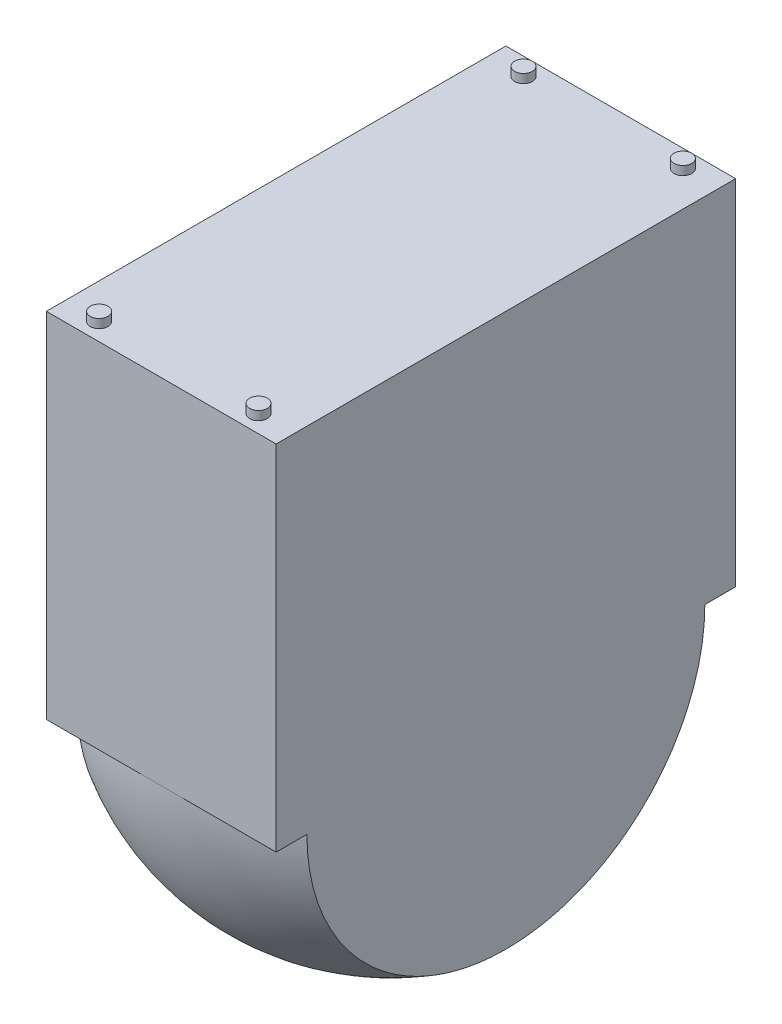
ISO-10303-21;
HEADER;
FILE_DESCRIPTION(('STEP AP214'),'2;1');
FILE_NAME('part.step','',(''),(''),'','','');
FILE_SCHEMA(('AUTOMOTIVE_DESIGN { 1 0 10303 214 1 1 1 1 }'));
ENDSEC;
DATA;
#1=APPLICATION_CONTEXT('core data for automotive mechanical design processes');
#2=APPLICATION_PROTOCOL_DEFINITION('international standard','automotive_design',2000,#1);
#3=PRODUCT_CONTEXT('',#1,'mechanical');
#4=PRODUCT('Part','Part','',(#3));
#5=PRODUCT_RELATED_PRODUCT_CATEGORY('part','',(#4));
#6=PRODUCT_DEFINITION_FORMATION('','',#4);
#7=PRODUCT_DEFINITION_CONTEXT('part definition',#1,'design');
#8=PRODUCT_DEFINITION('design','',#6,#7);
#9=PRODUCT_DEFINITION_SHAPE('','',#8);
#10=(LENGTH_UNIT() NAMED_UNIT(*) SI_UNIT(.MILLI.,.METRE.));
#11=(NAMED_UNIT(*) PLANE_ANGLE_UNIT() SI_UNIT($,.RADIAN.));
#12=(NAMED_UNIT(*) SI_UNIT($,.STERADIAN.) SOLID_ANGLE_UNIT());
#13=UNCERTAINTY_MEASURE_WITH_UNIT(LENGTH_MEASURE(1.E-05),#10,'distance_accuracy_value','');
#14=(GEOMETRIC_REPRESENTATION_CONTEXT(3) GLOBAL_UNCERTAINTY_ASSIGNED_CONTEXT((#13)) GLOBAL_UNIT_ASSIGNED_CONTEXT((#10,
#11,#12)) REPRESENTATION_CONTEXT('',''));
#15=CARTESIAN_POINT('',(0.,0.,0.));
#16=DIRECTION('',(0.,0.,1.));
#17=DIRECTION('',(1.,0.,0.));
#18=AXIS2_PLACEMENT_3D('',#15,#16,#17);
#19=CARTESIAN_POINT('',(0.,0.,0.));
#20=DIRECTION('',(0.,1.,0.));
#21=DIRECTION('',(1.,0.,0.));
#22=AXIS2_PLACEMENT_3D('',#19,#20,#21);
#23=SPHERICAL_SURFACE('',#22,130.);
#24=CARTESIAN_POINT('',(65.,0.,0.));
#25=DIRECTION('',(1.,0.,0.));
#26=DIRECTION('',(0.,0.,-1.));
#27=AXIS2_PLACEMENT_3D('',#24,#25,#26);
#28=CIRCLE('',#27,112.583302491977);
#29=CARTESIAN_POINT('',(65.,0.,112.583302491977));
#30=VERTEX_POINT('',#29);
#31=CARTESIAN_POINT('',(65.,0.,-112.583302491977));
#32=VERTEX_POINT('',#31);
#33=EDGE_CURVE('E219',#30,#32,#28,.T.);
#34=ORIENTED_EDGE('',*,*,#33,.F.);
#35=CARTESIAN_POINT('',(0.,0.,0.));
#36=DIRECTION('',(0.,1.,0.));
#37=DIRECTION('',(0.,0.,1.));
#38=AXIS2_PLACEMENT_3D('',#35,#36,#37);
#39=CIRCLE('',#38,130.);
#40=CARTESIAN_POINT('',(0.,0.,130.));
#41=VERTEX_POINT('',#40);
#42=EDGE_CURVE('E240',#41,#30,#39,.T.);
#43=ORIENTED_EDGE('',*,*,#42,.F.);
#44=CARTESIAN_POINT('',(-65.,0.,112.583302491977));
#45=VERTEX_POINT('',#44);
#46=EDGE_CURVE('E231',#45,#41,#39,.T.);
#47=ORIENTED_EDGE('',*,*,#46,.F.);
#48=CARTESIAN_POINT('',(-65.,0.,0.));
#49=DIRECTION('',(-1.,0.,0.));
#50=DIRECTION('',(0.,0.,1.));
#51=AXIS2_PLACEMENT_3D('',#48,#49,#50);
#52=CIRCLE('',#51,112.583302491977);
#53=CARTESIAN_POINT('',(-65.,0.,-112.583302491977));
#54=VERTEX_POINT('',#53);
#55=EDGE_CURVE('E211',#54,#45,#52,.T.);
#56=ORIENTED_EDGE('',*,*,#55,.F.);
#57=CARTESIAN_POINT('',(0.,0.,-130.));
#58=VERTEX_POINT('',#57);
#59=EDGE_CURVE('E241',#58,#54,#39,.T.);
#60=ORIENTED_EDGE('',*,*,#59,.F.);
#61=EDGE_CURVE('E238',#32,#58,#39,.T.);
#62=ORIENTED_EDGE('',*,*,#61,.F.);
#63=EDGE_LOOP('',(#34,#43,#47,#56,#60,#62));
#64=FACE_BOUND('',#63,.T.);
#65=ADVANCED_FACE('F35',(#64),#23,.T.);
#66=CARTESIAN_POINT('',(120.,0.,120.));
#67=DIRECTION('',(0.,1.,0.));
#68=DIRECTION('',(0.,0.,1.));
#69=AXIS2_PLACEMENT_3D('',#66,#67,#68);
#70=PLANE('',#69);
#71=DIRECTION('',(0.,0.,-1.));
#72=VECTOR('',#71,1.);
#73=CARTESIAN_POINT('',(65.,0.,120.));
#74=LINE('',#73,#72);
#75=CARTESIAN_POINT('',(65.,0.,130.));
#76=VERTEX_POINT('',#75);
#77=EDGE_CURVE('E221',#76,#30,#74,.T.);
#78=ORIENTED_EDGE('',*,*,#77,.F.);
#79=DIRECTION('',(1.,0.,0.));
#80=VECTOR('',#79,1.);
#81=CARTESIAN_POINT('',(-120.,0.,130.));
#82=LINE('',#81,#80);
#83=EDGE_CURVE('E235',#41,#76,#82,.T.);
#84=ORIENTED_EDGE('',*,*,#83,.F.);
#85=ORIENTED_EDGE('',*,*,#42,.T.);
#86=EDGE_LOOP('',(#78,#84,#85));
#87=FACE_BOUND('',#86,.T.);
#88=ADVANCED_FACE('F393',(#87),#70,.F.);
#89=DIRECTION('',(0.,0.,-1.));
#90=VECTOR('',#89,1.);
#91=CARTESIAN_POINT('',(65.,0.,120.));
#92=LINE('',#91,#90);
#93=CARTESIAN_POINT('',(65.,0.,-130.));
#94=VERTEX_POINT('',#93);
#95=EDGE_CURVE('E217',#32,#94,#92,.T.);
#96=ORIENTED_EDGE('',*,*,#95,.F.);
#97=ORIENTED_EDGE('',*,*,#61,.T.);
#98=DIRECTION('',(-1.,0.,0.));
#99=VECTOR('',#98,1.);
#100=CARTESIAN_POINT('',(-120.,0.,-130.));
#101=LINE('',#100,#99);
#102=EDGE_CURVE('E232',#94,#58,#101,.T.);
#103=ORIENTED_EDGE('',*,*,#102,.F.);
#104=EDGE_LOOP('',(#96,#97,#103));
#105=FACE_BOUND('',#104,.T.);
#106=ADVANCED_FACE('F398',(#105),#70,.F.);
#107=DIRECTION('',(0.,0.,1.));
#108=VECTOR('',#107,1.);
#109=CARTESIAN_POINT('',(-65.,0.,120.));
#110=LINE('',#109,#108);
#111=CARTESIAN_POINT('',(-65.,0.,-130.));
#112=VERTEX_POINT('',#111);
#113=EDGE_CURVE('E214',#112,#54,#110,.T.);
#114=ORIENTED_EDGE('',*,*,#113,.F.);
#115=EDGE_CURVE('E223',#58,#112,#101,.T.);
#116=ORIENTED_EDGE('',*,*,#115,.F.);
#117=ORIENTED_EDGE('',*,*,#59,.T.);
#118=EDGE_LOOP('',(#114,#116,#117));
#119=FACE_BOUND('',#118,.T.);
#120=ADVANCED_FACE('F423',(#119),#70,.F.);
#121=CARTESIAN_POINT('',(-120.,200.,-130.));
#122=DIRECTION('',(0.,0.,1.));
#123=DIRECTION('',(1.,0.,0.));
#124=AXIS2_PLACEMENT_3D('',#121,#122,#123);
#125=PLANE('',#124);
#126=CARTESIAN_POINT('',(7.11121604714485,147.850864108465,-130.));
#127=DIRECTION('',(0.,0.,-1.));
#128=DIRECTION('',(-1.,0.,0.));
#129=AXIS2_PLACEMENT_3D('',#126,#127,#128);
#130=CIRCLE('',#129,1.5);
#131=CARTESIAN_POINT('',(5.61121604714485,147.850864108465,-130.));
#132=VERTEX_POINT('',#131);
#133=EDGE_CURVE('E263',#132,#132,#130,.T.);
#134=ORIENTED_EDGE('',*,*,#133,.F.);
#135=EDGE_LOOP('',(#134));
#136=FACE_BOUND('',#135,.T.);
#137=CARTESIAN_POINT('',(26.0708093918858,127.11308997908,-130.));
#138=DIRECTION('',(0.,0.,-1.));
#139=DIRECTION('',(-1.,0.,0.));
#140=AXIS2_PLACEMENT_3D('',#137,#138,#139);
#141=CIRCLE('',#140,1.5);
#142=CARTESIAN_POINT('',(24.5708093918858,127.11308997908,-130.));
#143=VERTEX_POINT('',#142);
#144=EDGE_CURVE('E461',#143,#143,#141,.T.);
#145=ORIENTED_EDGE('',*,*,#144,.F.);
#146=EDGE_LOOP('',(#145));
#147=FACE_BOUND('',#146,.T.);
#148=CARTESIAN_POINT('',(7.11121604714485,127.11308997908,-130.));
#149=DIRECTION('',(0.,0.,-1.));
#150=DIRECTION('',(-1.,0.,0.));
#151=AXIS2_PLACEMENT_3D('',#148,#149,#150);
#152=CIRCLE('',#151,1.5);
#153=CARTESIAN_POINT('',(5.61121604714484,127.11308997908,-130.));
#154=VERTEX_POINT('',#153);
#155=EDGE_CURVE('E276',#154,#154,#152,.T.);
#156=ORIENTED_EDGE('',*,*,#155,.F.);
#157=EDGE_LOOP('',(#156));
#158=FACE_BOUND('',#157,.T.);
#159=CARTESIAN_POINT('',(26.0708093918858,147.850864108465,-130.));
#160=DIRECTION('',(0.,0.,-1.));
#161=DIRECTION('',(-1.,0.,0.));
#162=AXIS2_PLACEMENT_3D('',#159,#160,#161);
#163=CIRCLE('',#162,1.5);
#164=CARTESIAN_POINT('',(24.5708093918858,147.850864108465,-130.));
#165=VERTEX_POINT('',#164);
#166=EDGE_CURVE('E259',#165,#165,#163,.T.);
#167=ORIENTED_EDGE('',*,*,#166,.F.);
#168=EDGE_LOOP('',(#167));
#169=FACE_BOUND('',#168,.T.);
#170=ORIENTED_EDGE('',*,*,#115,.T.);
#171=DIRECTION('',(0.,-1.,0.));
#172=VECTOR('',#171,1.);
#173=CARTESIAN_POINT('',(-65.,-200.,-130.));
#174=LINE('',#173,#172);
#175=CARTESIAN_POINT('',(-65.,200.,-130.));
#176=VERTEX_POINT('',#175);
#177=EDGE_CURVE('E204',#176,#112,#174,.T.);
#178=ORIENTED_EDGE('',*,*,#177,.F.);
#179=DIRECTION('',(-1.,0.,0.));
#180=VECTOR('',#179,1.);
#181=CARTESIAN_POINT('',(-120.,200.,-130.));
#182=LINE('',#181,#180);
#183=CARTESIAN_POINT('',(65.,200.,-130.));
#184=VERTEX_POINT('',#183);
#185=EDGE_CURVE('E224',#184,#176,#182,.T.);
#186=ORIENTED_EDGE('',*,*,#185,.F.);
#187=DIRECTION('',(0.,1.,0.));
#188=VECTOR('',#187,1.);
#189=CARTESIAN_POINT('',(65.,-200.,-130.));
#190=LINE('',#189,#188);
#191=EDGE_CURVE('E202',#94,#184,#190,.T.);
#192=ORIENTED_EDGE('',*,*,#191,.F.);
#193=ORIENTED_EDGE('',*,*,#102,.T.);
#194=EDGE_LOOP('',(#170,#178,#186,#192,#193));
#195=FACE_BOUND('',#194,.T.);
#196=ADVANCED_FACE('F426',(#136,#147,#158,#169,#195),#125,.F.);
#197=CARTESIAN_POINT('',(-120.,200.,130.));
#198=DIRECTION('',(0.,0.,-1.));
#199=DIRECTION('',(-1.,0.,0.));
#200=AXIS2_PLACEMENT_3D('',#197,#198,#199);
#201=PLANE('',#200);
#202=DIRECTION('',(0.,-1.,0.));
#203=VECTOR('',#202,1.);
#204=CARTESIAN_POINT('',(-65.,-200.,130.));
#205=LINE('',#204,#203);
#206=CARTESIAN_POINT('',(-65.,200.,130.));
#207=VERTEX_POINT('',#206);
#208=CARTESIAN_POINT('',(-65.,0.,130.));
#209=VERTEX_POINT('',#208);
#210=EDGE_CURVE('E200',#207,#209,#205,.T.);
#211=ORIENTED_EDGE('',*,*,#210,.T.);
#212=EDGE_CURVE('E228',#209,#41,#82,.T.);
#213=ORIENTED_EDGE('',*,*,#212,.T.);
#214=ORIENTED_EDGE('',*,*,#83,.T.);
#215=DIRECTION('',(0.,1.,0.));
#216=VECTOR('',#215,1.);
#217=CARTESIAN_POINT('',(65.,-200.,130.));
#218=LINE('',#217,#216);
#219=CARTESIAN_POINT('',(65.,200.,130.));
#220=VERTEX_POINT('',#219);
#221=EDGE_CURVE('E188',#76,#220,#218,.T.);
#222=ORIENTED_EDGE('',*,*,#221,.T.);
#223=DIRECTION('',(1.,0.,0.));
#224=VECTOR('',#223,1.);
#225=CARTESIAN_POINT('',(-120.,200.,130.));
#226=LINE('',#225,#224);
#227=EDGE_CURVE('E227',#207,#220,#226,.T.);
#228=ORIENTED_EDGE('',*,*,#227,.F.);
#229=EDGE_LOOP('',(#211,#213,#214,#222,#228));
#230=FACE_BOUND('',#229,.T.);
#231=ADVANCED_FACE('F418',(#230),#201,.F.);
#232=CARTESIAN_POINT('',(120.,200.,120.));
#233=DIRECTION('',(0.,1.,0.));
#234=DIRECTION('',(0.,0.,1.));
#235=AXIS2_PLACEMENT_3D('',#232,#233,#234);
#236=PLANE('',#235);
#237=CARTESIAN_POINT('',(45.0939865651329,200.,-120.06732195188));
#238=DIRECTION('',(0.,1.,0.));
#239=DIRECTION('',(0.,0.,-1.));
#240=AXIS2_PLACEMENT_3D('',#237,#238,#239);
#241=CIRCLE('',#240,5.00000000000001);
#242=CARTESIAN_POINT('',(45.0939865651329,200.,-125.06732195188));
#243=VERTEX_POINT('',#242);
#244=EDGE_CURVE('E295',#243,#243,#241,.T.);
#245=ORIENTED_EDGE('',*,*,#244,.F.);
#246=EDGE_LOOP('',(#245));
#247=FACE_BOUND('',#246,.T.);
#248=CARTESIAN_POINT('',(45.0939865651329,200.,120.06732195188));
#249=DIRECTION('',(0.,1.,0.));
#250=DIRECTION('',(0.,0.,1.));
#251=AXIS2_PLACEMENT_3D('',#248,#249,#250);
#252=CIRCLE('',#251,5.00000000000001);
#253=CARTESIAN_POINT('',(45.0939865651329,200.,125.06732195188));
#254=VERTEX_POINT('',#253);
#255=EDGE_CURVE('E299',#254,#254,#252,.T.);
#256=ORIENTED_EDGE('',*,*,#255,.F.);
#257=EDGE_LOOP('',(#256));
#258=FACE_BOUND('',#257,.T.);
#259=CARTESIAN_POINT('',(-45.0939865651329,200.,120.06732195188));
#260=DIRECTION('',(0.,1.,0.));
#261=DIRECTION('',(0.,0.,-1.));
#262=AXIS2_PLACEMENT_3D('',#259,#260,#261);
#263=CIRCLE('',#262,5.00000000000001);
#264=CARTESIAN_POINT('',(-45.0939865651329,200.,115.06732195188));
#265=VERTEX_POINT('',#264);
#266=EDGE_CURVE('E305',#265,#265,#263,.T.);
#267=ORIENTED_EDGE('',*,*,#266,.F.);
#268=EDGE_LOOP('',(#267));
#269=FACE_BOUND('',#268,.T.);
#270=CARTESIAN_POINT('',(-45.0939865651329,200.,-120.06732195188));
#271=DIRECTION('',(0.,1.,0.));
#272=DIRECTION('',(0.,0.,1.));
#273=AXIS2_PLACEMENT_3D('',#270,#271,#272);
#274=CIRCLE('',#273,5.00000000000001);
#275=CARTESIAN_POINT('',(-45.0939865651329,200.,-115.06732195188));
#276=VERTEX_POINT('',#275);
#277=EDGE_CURVE('E311',#276,#276,#274,.T.);
#278=ORIENTED_EDGE('',*,*,#277,.F.);
#279=EDGE_LOOP('',(#278));
#280=FACE_BOUND('',#279,.T.);
#281=ORIENTED_EDGE('',*,*,#227,.T.);
#282=DIRECTION('',(0.,0.,1.));
#283=VECTOR('',#282,1.);
#284=CARTESIAN_POINT('',(65.,200.,-130.));
#285=LINE('',#284,#283);
#286=EDGE_CURVE('E207',#184,#220,#285,.T.);
#287=ORIENTED_EDGE('',*,*,#286,.F.);
#288=ORIENTED_EDGE('',*,*,#185,.T.);
#289=DIRECTION('',(0.,0.,1.));
#290=VECTOR('',#289,1.);
#291=CARTESIAN_POINT('',(-65.,200.,-130.));
#292=LINE('',#291,#290);
#293=EDGE_CURVE('E208',#176,#207,#292,.T.);
#294=ORIENTED_EDGE('',*,*,#293,.T.);
#295=EDGE_LOOP('',(#281,#287,#288,#294));
#296=FACE_BOUND('',#295,.T.);
#297=ADVANCED_FACE('F431',(#247,#258,#269,#280,#296),#236,.T.);
#298=ORIENTED_EDGE('',*,*,#46,.T.);
#299=ORIENTED_EDGE('',*,*,#212,.F.);
#300=DIRECTION('',(0.,0.,1.));
#301=VECTOR('',#300,1.);
#302=CARTESIAN_POINT('',(-65.,0.,120.));
#303=LINE('',#302,#301);
#304=EDGE_CURVE('E242',#45,#209,#303,.T.);
#305=ORIENTED_EDGE('',*,*,#304,.F.);
#306=EDGE_LOOP('',(#298,#299,#305));
#307=FACE_BOUND('',#306,.T.);
#308=ADVANCED_FACE('F401',(#307),#70,.F.);
#309=CARTESIAN_POINT('',(-65.,-200.,-130.));
#310=DIRECTION('',(-1.,0.,0.));
#311=DIRECTION('',(0.,0.,1.));
#312=AXIS2_PLACEMENT_3D('',#309,#310,#311);
#313=PLANE('',#312);
#314=DIRECTION('',(0.,0.,1.));
#315=VECTOR('',#314,1.);
#316=CARTESIAN_POINT('',(-65.,5.,120.));
#317=LINE('',#316,#315);
#318=CARTESIAN_POINT('',(-65.,5.,-112.138307460029));
#319=VERTEX_POINT('',#318);
#320=CARTESIAN_POINT('',(-65.,5.,-106.653645038508));
#321=VERTEX_POINT('',#320);
#322=EDGE_CURVE('E159',#319,#321,#317,.T.);
#323=ORIENTED_EDGE('',*,*,#322,.F.);
#324=CARTESIAN_POINT('',(-65.,0.,0.));
#325=DIRECTION('',(1.,0.,0.));
#326=DIRECTION('',(0.,0.,1.));
#327=AXIS2_PLACEMENT_3D('',#324,#325,#326);
#328=CIRCLE('',#327,112.249721603218);
#329=CARTESIAN_POINT('',(-65.,5.,112.138307460029));
#330=VERTEX_POINT('',#329);
#331=EDGE_CURVE('E317',#319,#330,#328,.T.);
#332=ORIENTED_EDGE('',*,*,#331,.T.);
#333=DIRECTION('',(0.,0.,1.));
#334=VECTOR('',#333,1.);
#335=CARTESIAN_POINT('',(-65.,5.,120.));
#336=LINE('',#335,#334);
#337=CARTESIAN_POINT('',(-65.,5.,106.653645038508));
#338=VERTEX_POINT('',#337);
#339=EDGE_CURVE('E186',#338,#330,#336,.T.);
#340=ORIENTED_EDGE('',*,*,#339,.F.);
#341=CARTESIAN_POINT('',(-65.,0.,0.));
#342=DIRECTION('',(-1.,0.,0.));
#343=DIRECTION('',(0.,0.,1.));
#344=AXIS2_PLACEMENT_3D('',#341,#342,#343);
#345=CIRCLE('',#344,106.770782520313);
#346=EDGE_CURVE('E178',#321,#338,#345,.T.);
#347=ORIENTED_EDGE('',*,*,#346,.F.);
#348=EDGE_LOOP('',(#323,#332,#340,#347));
#349=FACE_BOUND('',#348,.T.);
#350=DIRECTION('',(0.,-1.,0.));
#351=VECTOR('',#350,1.);
#352=CARTESIAN_POINT('',(-65.,-200.,125.));
#353=LINE('',#352,#351);
#354=CARTESIAN_POINT('',(-65.,195.,125.));
#355=VERTEX_POINT('',#354);
#356=CARTESIAN_POINT('',(-65.,135.,125.));
#357=VERTEX_POINT('',#356);
#358=EDGE_CURVE('E189',#355,#357,#353,.T.);
#359=ORIENTED_EDGE('',*,*,#358,.T.);
#360=DIRECTION('',(0.,0.,-1.));
#361=VECTOR('',#360,1.);
#362=CARTESIAN_POINT('',(-65.,135.,-130.));
#363=LINE('',#362,#361);
#364=CARTESIAN_POINT('',(-65.,135.,-125.));
#365=VERTEX_POINT('',#364);
#366=EDGE_CURVE('E324',#357,#365,#363,.T.);
#367=ORIENTED_EDGE('',*,*,#366,.T.);
#368=DIRECTION('',(0.,-1.,0.));
#369=VECTOR('',#368,1.);
#370=CARTESIAN_POINT('',(-65.,200.,-125.));
#371=LINE('',#370,#369);
#372=CARTESIAN_POINT('',(-65.,195.,-125.));
#373=VERTEX_POINT('',#372);
#374=EDGE_CURVE('E196',#373,#365,#371,.T.);
#375=ORIENTED_EDGE('',*,*,#374,.F.);
#376=DIRECTION('',(0.,0.,1.));
#377=VECTOR('',#376,1.);
#378=CARTESIAN_POINT('',(-65.,195.,120.));
#379=LINE('',#378,#377);
#380=EDGE_CURVE('E185',#373,#355,#379,.T.);
#381=ORIENTED_EDGE('',*,*,#380,.T.);
#382=EDGE_LOOP('',(#359,#367,#375,#381));
#383=FACE_BOUND('',#382,.T.);
#384=ORIENTED_EDGE('',*,*,#304,.T.);
#385=ORIENTED_EDGE('',*,*,#210,.F.);
#386=ORIENTED_EDGE('',*,*,#293,.F.);
#387=ORIENTED_EDGE('',*,*,#177,.T.);
#388=ORIENTED_EDGE('',*,*,#113,.T.);
#389=ORIENTED_EDGE('',*,*,#55,.T.);
#390=EDGE_LOOP('',(#384,#385,#386,#387,#388,#389));
#391=FACE_BOUND('',#390,.T.);
#392=ADVANCED_FACE('F360',(#349,#383,#391),#313,.T.);
#393=CARTESIAN_POINT('',(65.,-200.,-130.));
#394=DIRECTION('',(1.,0.,0.));
#395=DIRECTION('',(0.,0.,-1.));
#396=AXIS2_PLACEMENT_3D('',#393,#394,#395);
#397=PLANE('',#396);
#398=ORIENTED_EDGE('',*,*,#77,.T.);
#399=ORIENTED_EDGE('',*,*,#33,.T.);
#400=ORIENTED_EDGE('',*,*,#95,.T.);
#401=ORIENTED_EDGE('',*,*,#191,.T.);
#402=ORIENTED_EDGE('',*,*,#286,.T.);
#403=ORIENTED_EDGE('',*,*,#221,.F.);
#404=EDGE_LOOP('',(#398,#399,#400,#401,#402,#403));
#405=FACE_BOUND('',#404,.T.);
#406=ADVANCED_FACE('F434',(#405),#397,.T.);
#407=CARTESIAN_POINT('',(0.,0.,0.));
#408=DIRECTION('',(0.,1.,0.));
#409=DIRECTION('',(1.,0.,0.));
#410=AXIS2_PLACEMENT_3D('',#407,#408,#409);
#411=SPHERICAL_SURFACE('',#410,125.);
#412=CARTESIAN_POINT('',(60.,0.,0.));
#413=DIRECTION('',(1.,0.,0.));
#414=DIRECTION('',(0.,0.,-1.));
#415=AXIS2_PLACEMENT_3D('',#412,#413,#414);
#416=CIRCLE('',#415,109.658560997307);
#417=CARTESIAN_POINT('',(60.,5.,109.544511501033));
#418=VERTEX_POINT('',#417);
#419=CARTESIAN_POINT('',(60.,5.,-109.544511501033));
#420=VERTEX_POINT('',#419);
#421=EDGE_CURVE('E168',#418,#420,#416,.T.);
#422=ORIENTED_EDGE('',*,*,#421,.T.);
#423=CARTESIAN_POINT('',(0.,5.,0.));
#424=DIRECTION('',(0.,1.,0.));
#425=DIRECTION('',(0.,0.,1.));
#426=AXIS2_PLACEMENT_3D('',#423,#424,#425);
#427=CIRCLE('',#426,124.899959967968);
#428=EDGE_CURVE('E153',#420,#321,#427,.T.);
#429=ORIENTED_EDGE('',*,*,#428,.T.);
#430=ORIENTED_EDGE('',*,*,#346,.T.);
#431=CARTESIAN_POINT('',(0.,5.,0.));
#432=DIRECTION('',(0.,1.,0.));
#433=DIRECTION('',(0.,0.,1.));
#434=AXIS2_PLACEMENT_3D('',#431,#432,#433);
#435=CIRCLE('',#434,124.899959967968);
#436=EDGE_CURVE('E163',#338,#418,#435,.T.);
#437=ORIENTED_EDGE('',*,*,#436,.T.);
#438=EDGE_LOOP('',(#422,#429,#430,#437));
#439=FACE_BOUND('',#438,.T.);
#440=ADVANCED_FACE('F169',(#439),#411,.F.);
#441=CARTESIAN_POINT('',(120.,5.,120.));
#442=DIRECTION('',(0.,1.,0.));
#443=DIRECTION('',(0.,0.,1.));
#444=AXIS2_PLACEMENT_3D('',#441,#442,#443);
#445=PLANE('',#444);
#446=DIRECTION('',(-1.,0.,0.));
#447=VECTOR('',#446,1.);
#448=CARTESIAN_POINT('',(-62.,5.,-112.138307460029));
#449=LINE('',#448,#447);
#450=CARTESIAN_POINT('',(-62.,5.,-112.138307460029));
#451=VERTEX_POINT('',#450);
#452=EDGE_CURVE('E55',#319,#451,#449,.F.);
#453=ORIENTED_EDGE('',*,*,#452,.F.);
#454=ORIENTED_EDGE('',*,*,#322,.T.);
#455=ORIENTED_EDGE('',*,*,#428,.F.);
#456=DIRECTION('',(0.,0.,-1.));
#457=VECTOR('',#456,1.);
#458=CARTESIAN_POINT('',(60.,5.,120.));
#459=LINE('',#458,#457);
#460=CARTESIAN_POINT('',(60.,5.,-125.));
#461=VERTEX_POINT('',#460);
#462=EDGE_CURVE('E157',#420,#461,#459,.T.);
#463=ORIENTED_EDGE('',*,*,#462,.T.);
#464=DIRECTION('',(-1.,0.,0.));
#465=VECTOR('',#464,1.);
#466=CARTESIAN_POINT('',(-120.,5.,-125.));
#467=LINE('',#466,#465);
#468=CARTESIAN_POINT('',(-62.,5.,-125.));
#469=VERTEX_POINT('',#468);
#470=EDGE_CURVE('E182',#461,#469,#467,.T.);
#471=ORIENTED_EDGE('',*,*,#470,.T.);
#472=DIRECTION('',(0.,0.,1.));
#473=VECTOR('',#472,1.);
#474=CARTESIAN_POINT('',(-62.,5.,120.));
#475=LINE('',#474,#473);
#476=EDGE_CURVE('E51',#469,#451,#475,.T.);
#477=ORIENTED_EDGE('',*,*,#476,.T.);
#478=EDGE_LOOP('',(#453,#454,#455,#463,#471,#477));
#479=FACE_BOUND('',#478,.T.);
#480=ADVANCED_FACE('F155',(#479),#445,.T.);
#481=CARTESIAN_POINT('',(-120.,200.,-125.));
#482=DIRECTION('',(0.,0.,1.));
#483=DIRECTION('',(1.,0.,0.));
#484=AXIS2_PLACEMENT_3D('',#481,#482,#483);
#485=PLANE('',#484);
#486=CARTESIAN_POINT('',(7.11121604714485,147.850864108465,-125.));
#487=DIRECTION('',(0.,0.,1.));
#488=DIRECTION('',(1.,0.,0.));
#489=AXIS2_PLACEMENT_3D('',#486,#487,#488);
#490=CIRCLE('',#489,1.5);
#491=CARTESIAN_POINT('',(8.61121604714485,147.850864108465,-125.));
#492=VERTEX_POINT('',#491);
#493=EDGE_CURVE('E38',#492,#492,#490,.T.);
#494=ORIENTED_EDGE('',*,*,#493,.F.);
#495=EDGE_LOOP('',(#494));
#496=FACE_BOUND('',#495,.T.);
#497=CARTESIAN_POINT('',(26.0708093918858,127.11308997908,-125.));
#498=DIRECTION('',(0.,0.,1.));
#499=DIRECTION('',(1.,0.,0.));
#500=AXIS2_PLACEMENT_3D('',#497,#498,#499);
#501=CIRCLE('',#500,1.5);
#502=CARTESIAN_POINT('',(27.5708093918858,127.11308997908,-125.));
#503=VERTEX_POINT('',#502);
#504=EDGE_CURVE('E262',#503,#503,#501,.T.);
#505=ORIENTED_EDGE('',*,*,#504,.F.);
#506=EDGE_LOOP('',(#505));
#507=FACE_BOUND('',#506,.T.);
#508=CARTESIAN_POINT('',(7.11121604714485,127.11308997908,-125.));
#509=DIRECTION('',(0.,0.,1.));
#510=DIRECTION('',(1.,0.,0.));
#511=AXIS2_PLACEMENT_3D('',#508,#509,#510);
#512=CIRCLE('',#511,1.5);
#513=CARTESIAN_POINT('',(8.61121604714485,127.11308997908,-125.));
#514=VERTEX_POINT('',#513);
#515=EDGE_CURVE('E260',#514,#514,#512,.T.);
#516=ORIENTED_EDGE('',*,*,#515,.F.);
#517=EDGE_LOOP('',(#516));
#518=FACE_BOUND('',#517,.T.);
#519=CARTESIAN_POINT('',(26.0708093918858,147.850864108465,-125.));
#520=DIRECTION('',(0.,0.,1.));
#521=DIRECTION('',(1.,0.,0.));
#522=AXIS2_PLACEMENT_3D('',#519,#520,#521);
#523=CIRCLE('',#522,1.5);
#524=CARTESIAN_POINT('',(27.5708093918858,147.850864108465,-125.));
#525=VERTEX_POINT('',#524);
#526=EDGE_CURVE('E255',#525,#525,#523,.T.);
#527=ORIENTED_EDGE('',*,*,#526,.F.);
#528=EDGE_LOOP('',(#527));
#529=FACE_BOUND('',#528,.T.);
#530=DIRECTION('',(-1.,0.,0.));
#531=VECTOR('',#530,1.);
#532=CARTESIAN_POINT('',(-120.,135.,-125.));
#533=LINE('',#532,#531);
#534=CARTESIAN_POINT('',(-62.,135.,-125.));
#535=VERTEX_POINT('',#534);
#536=EDGE_CURVE('E337',#535,#365,#533,.T.);
#537=ORIENTED_EDGE('',*,*,#536,.F.);
#538=DIRECTION('',(0.,-1.,0.));
#539=VECTOR('',#538,1.);
#540=CARTESIAN_POINT('',(-62.,200.,-125.));
#541=LINE('',#540,#539);
#542=EDGE_CURVE('E333',#535,#469,#541,.T.);
#543=ORIENTED_EDGE('',*,*,#542,.T.);
#544=ORIENTED_EDGE('',*,*,#470,.F.);
#545=DIRECTION('',(0.,1.,0.));
#546=VECTOR('',#545,1.);
#547=CARTESIAN_POINT('',(60.,200.,-125.));
#548=LINE('',#547,#546);
#549=CARTESIAN_POINT('',(60.,195.,-125.));
#550=VERTEX_POINT('',#549);
#551=EDGE_CURVE('E176',#461,#550,#548,.T.);
#552=ORIENTED_EDGE('',*,*,#551,.T.);
#553=DIRECTION('',(-1.,0.,0.));
#554=VECTOR('',#553,1.);
#555=CARTESIAN_POINT('',(-120.,195.,-125.));
#556=LINE('',#555,#554);
#557=EDGE_CURVE('E344',#550,#373,#556,.T.);
#558=ORIENTED_EDGE('',*,*,#557,.T.);
#559=ORIENTED_EDGE('',*,*,#374,.T.);
#560=EDGE_LOOP('',(#537,#543,#544,#552,#558,#559));
#561=FACE_BOUND('',#560,.T.);
#562=ADVANCED_FACE('F351',(#496,#507,#518,#529,#561),#485,.T.);
#563=CARTESIAN_POINT('',(-120.,200.,125.));
#564=DIRECTION('',(0.,0.,-1.));
#565=DIRECTION('',(-1.,0.,0.));
#566=AXIS2_PLACEMENT_3D('',#563,#564,#565);
#567=PLANE('',#566);
#568=DIRECTION('',(1.,0.,0.));
#569=VECTOR('',#568,1.);
#570=CARTESIAN_POINT('',(-120.,135.,125.));
#571=LINE('',#570,#569);
#572=CARTESIAN_POINT('',(-62.,135.,125.));
#573=VERTEX_POINT('',#572);
#574=EDGE_CURVE('E250',#357,#573,#571,.T.);
#575=ORIENTED_EDGE('',*,*,#574,.F.);
#576=ORIENTED_EDGE('',*,*,#358,.F.);
#577=DIRECTION('',(1.,0.,0.));
#578=VECTOR('',#577,1.);
#579=CARTESIAN_POINT('',(-120.,195.,125.));
#580=LINE('',#579,#578);
#581=CARTESIAN_POINT('',(60.,195.,125.));
#582=VERTEX_POINT('',#581);
#583=EDGE_CURVE('E164',#355,#582,#580,.T.);
#584=ORIENTED_EDGE('',*,*,#583,.T.);
#585=DIRECTION('',(0.,1.,0.));
#586=VECTOR('',#585,1.);
#587=CARTESIAN_POINT('',(60.,-200.,125.));
#588=LINE('',#587,#586);
#589=CARTESIAN_POINT('',(60.,5.,125.));
#590=VERTEX_POINT('',#589);
#591=EDGE_CURVE('E192',#590,#582,#588,.T.);
#592=ORIENTED_EDGE('',*,*,#591,.F.);
#593=DIRECTION('',(1.,0.,0.));
#594=VECTOR('',#593,1.);
#595=CARTESIAN_POINT('',(-120.,5.,125.));
#596=LINE('',#595,#594);
#597=CARTESIAN_POINT('',(-62.,5.,125.));
#598=VERTEX_POINT('',#597);
#599=EDGE_CURVE('E342',#598,#590,#596,.T.);
#600=ORIENTED_EDGE('',*,*,#599,.F.);
#601=DIRECTION('',(0.,1.,0.));
#602=VECTOR('',#601,1.);
#603=CARTESIAN_POINT('',(-62.,200.,125.));
#604=LINE('',#603,#602);
#605=EDGE_CURVE('E327',#598,#573,#604,.T.);
#606=ORIENTED_EDGE('',*,*,#605,.T.);
#607=EDGE_LOOP('',(#575,#576,#584,#592,#600,#606));
#608=FACE_BOUND('',#607,.T.);
#609=ADVANCED_FACE('F381',(#608),#567,.T.);
#610=CARTESIAN_POINT('',(120.,195.,120.));
#611=DIRECTION('',(0.,1.,0.));
#612=DIRECTION('',(0.,0.,1.));
#613=AXIS2_PLACEMENT_3D('',#610,#611,#612);
#614=PLANE('',#613);
#615=ORIENTED_EDGE('',*,*,#583,.F.);
#616=ORIENTED_EDGE('',*,*,#380,.F.);
#617=ORIENTED_EDGE('',*,*,#557,.F.);
#618=DIRECTION('',(0.,0.,1.));
#619=VECTOR('',#618,1.);
#620=CARTESIAN_POINT('',(60.,195.,-130.));
#621=LINE('',#620,#619);
#622=EDGE_CURVE('E195',#550,#582,#621,.T.);
#623=ORIENTED_EDGE('',*,*,#622,.T.);
#624=EDGE_LOOP('',(#615,#616,#617,#623));
#625=FACE_BOUND('',#624,.T.);
#626=ADVANCED_FACE('F357',(#625),#614,.F.);
#627=DIRECTION('',(-1.,0.,0.));
#628=VECTOR('',#627,1.);
#629=CARTESIAN_POINT('',(-62.,5.,112.138307460029));
#630=LINE('',#629,#628);
#631=CARTESIAN_POINT('',(-62.,5.,112.138307460029));
#632=VERTEX_POINT('',#631);
#633=EDGE_CURVE('E247',#632,#330,#630,.T.);
#634=ORIENTED_EDGE('',*,*,#633,.F.);
#635=DIRECTION('',(0.,0.,1.));
#636=VECTOR('',#635,1.);
#637=CARTESIAN_POINT('',(-62.,5.,120.));
#638=LINE('',#637,#636);
#639=EDGE_CURVE('E245',#632,#598,#638,.T.);
#640=ORIENTED_EDGE('',*,*,#639,.T.);
#641=ORIENTED_EDGE('',*,*,#599,.T.);
#642=DIRECTION('',(0.,0.,-1.));
#643=VECTOR('',#642,1.);
#644=CARTESIAN_POINT('',(60.,5.,120.));
#645=LINE('',#644,#643);
#646=EDGE_CURVE('E172',#590,#418,#645,.T.);
#647=ORIENTED_EDGE('',*,*,#646,.T.);
#648=ORIENTED_EDGE('',*,*,#436,.F.);
#649=ORIENTED_EDGE('',*,*,#339,.T.);
#650=EDGE_LOOP('',(#634,#640,#641,#647,#648,#649));
#651=FACE_BOUND('',#650,.T.);
#652=ADVANCED_FACE('F378',(#651),#445,.T.);
#653=CARTESIAN_POINT('',(60.,-200.,-130.));
#654=DIRECTION('',(1.,0.,0.));
#655=DIRECTION('',(0.,0.,-1.));
#656=AXIS2_PLACEMENT_3D('',#653,#654,#655);
#657=PLANE('',#656);
#658=CARTESIAN_POINT('',(60.,96.8447288710538,-92.612625974497));
#659=DIRECTION('',(1.,0.,0.));
#660=DIRECTION('',(0.,0.,-1.));
#661=AXIS2_PLACEMENT_3D('',#658,#659,#660);
#662=CIRCLE('',#661,10.);
#663=CARTESIAN_POINT('',(60.,96.8447288710538,-102.612625974497));
#664=VERTEX_POINT('',#663);
#665=EDGE_CURVE('E12',#664,#664,#662,.F.);
#666=ORIENTED_EDGE('',*,*,#665,.F.);
#667=EDGE_LOOP('',(#666));
#668=FACE_BOUND('',#667,.T.);
#669=CARTESIAN_POINT('',(60.,0.,0.));
#670=DIRECTION('',(1.,0.,0.));
#671=DIRECTION('',(0.,0.,-1.));
#672=AXIS2_PLACEMENT_3D('',#669,#670,#671);
#673=CIRCLE('',#672,38.);
#674=CARTESIAN_POINT('',(60.,0.,-38.));
#675=VERTEX_POINT('',#674);
#676=EDGE_CURVE('E43',#675,#675,#673,.F.);
#677=ORIENTED_EDGE('',*,*,#676,.F.);
#678=EDGE_LOOP('',(#677));
#679=FACE_BOUND('',#678,.T.);
#680=ORIENTED_EDGE('',*,*,#646,.F.);
#681=ORIENTED_EDGE('',*,*,#591,.T.);
#682=ORIENTED_EDGE('',*,*,#622,.F.);
#683=ORIENTED_EDGE('',*,*,#551,.F.);
#684=ORIENTED_EDGE('',*,*,#462,.F.);
#685=ORIENTED_EDGE('',*,*,#421,.F.);
#686=EDGE_LOOP('',(#680,#681,#682,#683,#684,#685));
#687=FACE_BOUND('',#686,.T.);
#688=ADVANCED_FACE('F174',(#668,#679,#687),#657,.F.);
#689=CARTESIAN_POINT('',(-62.,0.,0.));
#690=DIRECTION('',(-1.,0.,0.));
#691=DIRECTION('',(0.,0.,1.));
#692=AXIS2_PLACEMENT_3D('',#689,#690,#691);
#693=CYLINDRICAL_SURFACE('',#692,112.249721603218);
#694=ORIENTED_EDGE('',*,*,#331,.F.);
#695=ORIENTED_EDGE('',*,*,#452,.T.);
#696=CARTESIAN_POINT('',(-62.,0.,0.));
#697=DIRECTION('',(1.,0.,0.));
#698=DIRECTION('',(0.,0.,1.));
#699=AXIS2_PLACEMENT_3D('',#696,#697,#698);
#700=CIRCLE('',#699,112.249721603218);
#701=EDGE_CURVE('E320',#451,#632,#700,.T.);
#702=ORIENTED_EDGE('',*,*,#701,.T.);
#703=ORIENTED_EDGE('',*,*,#633,.T.);
#704=EDGE_LOOP('',(#694,#695,#702,#703));
#705=FACE_BOUND('',#704,.T.);
#706=ADVANCED_FACE('F374',(#705),#693,.F.);
#707=CARTESIAN_POINT('',(-62.,135.,-130.));
#708=DIRECTION('',(0.,1.,0.));
#709=DIRECTION('',(0.,0.,1.));
#710=AXIS2_PLACEMENT_3D('',#707,#708,#709);
#711=PLANE('',#710);
#712=DIRECTION('',(0.,0.,-1.));
#713=VECTOR('',#712,1.);
#714=CARTESIAN_POINT('',(-62.,135.,-130.));
#715=LINE('',#714,#713);
#716=EDGE_CURVE('E323',#573,#535,#715,.T.);
#717=ORIENTED_EDGE('',*,*,#716,.T.);
#718=ORIENTED_EDGE('',*,*,#536,.T.);
#719=ORIENTED_EDGE('',*,*,#366,.F.);
#720=ORIENTED_EDGE('',*,*,#574,.T.);
#721=EDGE_LOOP('',(#717,#718,#719,#720));
#722=FACE_BOUND('',#721,.T.);
#723=ADVANCED_FACE('F365',(#722),#711,.T.);
#724=CARTESIAN_POINT('',(-62.,0.,0.));
#725=DIRECTION('',(-1.,0.,0.));
#726=DIRECTION('',(0.,0.,1.));
#727=AXIS2_PLACEMENT_3D('',#724,#725,#726);
#728=PLANE('',#727);
#729=ORIENTED_EDGE('',*,*,#476,.F.);
#730=ORIENTED_EDGE('',*,*,#542,.F.);
#731=ORIENTED_EDGE('',*,*,#716,.F.);
#732=ORIENTED_EDGE('',*,*,#605,.F.);
#733=ORIENTED_EDGE('',*,*,#639,.F.);
#734=ORIENTED_EDGE('',*,*,#701,.F.);
#735=EDGE_LOOP('',(#729,#730,#731,#732,#733,#734));
#736=FACE_BOUND('',#735,.T.);
#737=ADVANCED_FACE('F369',(#736),#728,.F.);
#738=CARTESIAN_POINT('',(-45.0939865651329,205.,-120.06732195188));
#739=DIRECTION('',(0.,-1.,0.));
#740=DIRECTION('',(0.,0.,-1.));
#741=AXIS2_PLACEMENT_3D('',#738,#739,#740);
#742=CYLINDRICAL_SURFACE('',#741,5.00000000000001);
#743=CARTESIAN_POINT('',(-45.0939865651329,205.,-120.06732195188));
#744=DIRECTION('',(0.,1.,0.));
#745=DIRECTION('',(0.,0.,1.));
#746=AXIS2_PLACEMENT_3D('',#743,#744,#745);
#747=CIRCLE('',#746,5.00000000000001);
#748=CARTESIAN_POINT('',(-45.0939865651329,205.,-115.06732195188));
#749=VERTEX_POINT('',#748);
#750=EDGE_CURVE('E314',#749,#749,#747,.T.);
#751=ORIENTED_EDGE('',*,*,#750,.F.);
#752=EDGE_LOOP('',(#751));
#753=FACE_BOUND('',#752,.T.);
#754=ORIENTED_EDGE('',*,*,#277,.T.);
#755=EDGE_LOOP('',(#754));
#756=FACE_BOUND('',#755,.T.);
#757=ADVANCED_FACE('F539',(#753,#756),#742,.T.);
#758=CARTESIAN_POINT('',(-45.0939865651329,205.,-120.06732195188));
#759=DIRECTION('',(0.,1.,0.));
#760=DIRECTION('',(0.,0.,1.));
#761=AXIS2_PLACEMENT_3D('',#758,#759,#760);
#762=PLANE('',#761);
#763=ORIENTED_EDGE('',*,*,#750,.T.);
#764=EDGE_LOOP('',(#763));
#765=FACE_BOUND('',#764,.T.);
#766=ADVANCED_FACE('F535',(#765),#762,.T.);
#767=CARTESIAN_POINT('',(-45.0939865651329,205.,120.06732195188));
#768=DIRECTION('',(0.,-1.,0.));
#769=DIRECTION('',(0.,0.,-1.));
#770=AXIS2_PLACEMENT_3D('',#767,#768,#769);
#771=CYLINDRICAL_SURFACE('',#770,5.00000000000001);
#772=CARTESIAN_POINT('',(-45.0939865651329,205.,120.06732195188));
#773=DIRECTION('',(0.,1.,0.));
#774=DIRECTION('',(0.,0.,-1.));
#775=AXIS2_PLACEMENT_3D('',#772,#773,#774);
#776=CIRCLE('',#775,5.00000000000001);
#777=CARTESIAN_POINT('',(-45.0939865651329,205.,115.06732195188));
#778=VERTEX_POINT('',#777);
#779=EDGE_CURVE('E308',#778,#778,#776,.T.);
#780=ORIENTED_EDGE('',*,*,#779,.F.);
#781=EDGE_LOOP('',(#780));
#782=FACE_BOUND('',#781,.T.);
#783=ORIENTED_EDGE('',*,*,#266,.T.);
#784=EDGE_LOOP('',(#783));
#785=FACE_BOUND('',#784,.T.);
#786=ADVANCED_FACE('F531',(#782,#785),#771,.T.);
#787=CARTESIAN_POINT('',(-45.0939865651329,205.,120.06732195188));
#788=DIRECTION('',(0.,-1.,0.));
#789=DIRECTION('',(0.,0.,-1.));
#790=AXIS2_PLACEMENT_3D('',#787,#788,#789);
#791=PLANE('',#790);
#792=ORIENTED_EDGE('',*,*,#779,.T.);
#793=EDGE_LOOP('',(#792));
#794=FACE_BOUND('',#793,.T.);
#795=ADVANCED_FACE('F527',(#794),#791,.F.);
#796=CARTESIAN_POINT('',(45.0939865651329,205.,120.06732195188));
#797=DIRECTION('',(0.,-1.,0.));
#798=DIRECTION('',(0.,0.,-1.));
#799=AXIS2_PLACEMENT_3D('',#796,#797,#798);
#800=CYLINDRICAL_SURFACE('',#799,5.00000000000001);
#801=CARTESIAN_POINT('',(45.0939865651329,205.,120.06732195188));
#802=DIRECTION('',(0.,1.,0.));
#803=DIRECTION('',(0.,0.,1.));
#804=AXIS2_PLACEMENT_3D('',#801,#802,#803);
#805=CIRCLE('',#804,5.00000000000001);
#806=CARTESIAN_POINT('',(45.0939865651329,205.,125.06732195188));
#807=VERTEX_POINT('',#806);
#808=EDGE_CURVE('E302',#807,#807,#805,.T.);
#809=ORIENTED_EDGE('',*,*,#808,.F.);
#810=EDGE_LOOP('',(#809));
#811=FACE_BOUND('',#810,.T.);
#812=ORIENTED_EDGE('',*,*,#255,.T.);
#813=EDGE_LOOP('',(#812));
#814=FACE_BOUND('',#813,.T.);
#815=ADVANCED_FACE('F523',(#811,#814),#800,.T.);
#816=CARTESIAN_POINT('',(45.0939865651329,205.,120.06732195188));
#817=DIRECTION('',(0.,1.,0.));
#818=DIRECTION('',(0.,0.,1.));
#819=AXIS2_PLACEMENT_3D('',#816,#817,#818);
#820=PLANE('',#819);
#821=ORIENTED_EDGE('',*,*,#808,.T.);
#822=EDGE_LOOP('',(#821));
#823=FACE_BOUND('',#822,.T.);
#824=ADVANCED_FACE('F519',(#823),#820,.T.);
#825=CARTESIAN_POINT('',(45.0939865651329,205.,-120.06732195188));
#826=DIRECTION('',(0.,-1.,0.));
#827=DIRECTION('',(0.,0.,-1.));
#828=AXIS2_PLACEMENT_3D('',#825,#826,#827);
#829=CYLINDRICAL_SURFACE('',#828,5.00000000000001);
#830=CARTESIAN_POINT('',(45.0939865651329,205.,-120.06732195188));
#831=DIRECTION('',(0.,1.,0.));
#832=DIRECTION('',(0.,0.,-1.));
#833=AXIS2_PLACEMENT_3D('',#830,#831,#832);
#834=CIRCLE('',#833,5.00000000000001);
#835=CARTESIAN_POINT('',(45.0939865651329,205.,-125.06732195188));
#836=VERTEX_POINT('',#835);
#837=EDGE_CURVE('E296',#836,#836,#834,.T.);
#838=ORIENTED_EDGE('',*,*,#837,.F.);
#839=EDGE_LOOP('',(#838));
#840=FACE_BOUND('',#839,.T.);
#841=ORIENTED_EDGE('',*,*,#244,.T.);
#842=EDGE_LOOP('',(#841));
#843=FACE_BOUND('',#842,.T.);
#844=ADVANCED_FACE('F515',(#840,#843),#829,.T.);
#845=CARTESIAN_POINT('',(45.0939865651329,205.,-120.06732195188));
#846=DIRECTION('',(0.,-1.,0.));
#847=DIRECTION('',(0.,0.,-1.));
#848=AXIS2_PLACEMENT_3D('',#845,#846,#847);
#849=PLANE('',#848);
#850=ORIENTED_EDGE('',*,*,#837,.T.);
#851=EDGE_LOOP('',(#850));
#852=FACE_BOUND('',#851,.T.);
#853=ADVANCED_FACE('F508',(#852),#849,.F.);
#854=CARTESIAN_POINT('',(45.,0.,0.));
#855=DIRECTION('',(-1.,0.,0.));
#856=DIRECTION('',(0.,0.,1.));
#857=AXIS2_PLACEMENT_3D('',#854,#855,#856);
#858=PLANE('',#857);
#859=CARTESIAN_POINT('',(45.,0.,0.));
#860=DIRECTION('',(-1.,0.,0.));
#861=DIRECTION('',(0.,0.,1.));
#862=AXIS2_PLACEMENT_3D('',#859,#860,#861);
#863=CIRCLE('',#862,38.);
#864=CARTESIAN_POINT('',(45.,0.,38.));
#865=VERTEX_POINT('',#864);
#866=EDGE_CURVE('E290',#865,#865,#863,.T.);
#867=ORIENTED_EDGE('',*,*,#866,.T.);
#868=EDGE_LOOP('',(#867));
#869=FACE_BOUND('',#868,.T.);
#870=CARTESIAN_POINT('',(45.,0.,0.));
#871=DIRECTION('',(-1.,0.,0.));
#872=DIRECTION('',(0.,0.,1.));
#873=AXIS2_PLACEMENT_3D('',#870,#871,#872);
#874=CIRCLE('',#873,16.);
#875=CARTESIAN_POINT('',(45.,0.,16.));
#876=VERTEX_POINT('',#875);
#877=EDGE_CURVE('E287',#876,#876,#874,.T.);
#878=ORIENTED_EDGE('',*,*,#877,.F.);
#879=EDGE_LOOP('',(#878));
#880=FACE_BOUND('',#879,.T.);
#881=ADVANCED_FACE('F505',(#869,#880),#858,.T.);
#882=CARTESIAN_POINT('',(45.,0.,0.));
#883=DIRECTION('',(1.,0.,0.));
#884=DIRECTION('',(0.,0.,-1.));
#885=AXIS2_PLACEMENT_3D('',#882,#883,#884);
#886=CYLINDRICAL_SURFACE('',#885,38.);
#887=ORIENTED_EDGE('',*,*,#866,.F.);
#888=EDGE_LOOP('',(#887));
#889=FACE_BOUND('',#888,.T.);
#890=ORIENTED_EDGE('',*,*,#676,.T.);
#891=EDGE_LOOP('',(#890));
#892=FACE_BOUND('',#891,.T.);
#893=ADVANCED_FACE('F503',(#889,#892),#886,.T.);
#894=CARTESIAN_POINT('',(45.,0.,0.));
#895=DIRECTION('',(1.,0.,0.));
#896=DIRECTION('',(0.,0.,-1.));
#897=AXIS2_PLACEMENT_3D('',#894,#895,#896);
#898=CYLINDRICAL_SURFACE('',#897,16.);
#899=ORIENTED_EDGE('',*,*,#877,.T.);
#900=EDGE_LOOP('',(#899));
#901=FACE_BOUND('',#900,.T.);
#902=CARTESIAN_POINT('',(60.,0.,0.));
#903=DIRECTION('',(-1.,0.,0.));
#904=DIRECTION('',(0.,0.,1.));
#905=AXIS2_PLACEMENT_3D('',#902,#903,#904);
#906=CIRCLE('',#905,16.);
#907=CARTESIAN_POINT('',(60.,0.,16.));
#908=VERTEX_POINT('',#907);
#909=EDGE_CURVE('E286',#908,#908,#906,.T.);
#910=ORIENTED_EDGE('',*,*,#909,.F.);
#911=EDGE_LOOP('',(#910));
#912=FACE_BOUND('',#911,.T.);
#913=ADVANCED_FACE('F500',(#901,#912),#898,.F.);
#914=ORIENTED_EDGE('',*,*,#909,.T.);
#915=EDGE_LOOP('',(#914));
#916=FACE_BOUND('',#915,.T.);
#917=ADVANCED_FACE('F495',(#916),#657,.F.);
#918=CARTESIAN_POINT('',(45.,96.8447288710538,-92.612625974497));
#919=DIRECTION('',(-1.,0.,0.));
#920=DIRECTION('',(0.,0.,1.));
#921=AXIS2_PLACEMENT_3D('',#918,#919,#920);
#922=PLANE('',#921);
#923=CARTESIAN_POINT('',(45.,96.8447288710538,-92.612625974497));
#924=DIRECTION('',(-1.,0.,0.));
#925=DIRECTION('',(0.,0.,1.));
#926=AXIS2_PLACEMENT_3D('',#923,#924,#925);
#927=CIRCLE('',#926,10.);
#928=CARTESIAN_POINT('',(45.,96.8447288710538,-82.612625974497));
#929=VERTEX_POINT('',#928);
#930=EDGE_CURVE('E281',#929,#929,#927,.T.);
#931=ORIENTED_EDGE('',*,*,#930,.T.);
#932=EDGE_LOOP('',(#931));
#933=FACE_BOUND('',#932,.T.);
#934=CARTESIAN_POINT('',(45.,96.8447288710538,-92.612625974497));
#935=DIRECTION('',(-1.,0.,0.));
#936=DIRECTION('',(0.,0.,1.));
#937=AXIS2_PLACEMENT_3D('',#934,#935,#936);
#938=CIRCLE('',#937,4.99999999999999);
#939=CARTESIAN_POINT('',(45.,96.8447288710538,-87.612625974497));
#940=VERTEX_POINT('',#939);
#941=EDGE_CURVE('E278',#940,#940,#938,.T.);
#942=ORIENTED_EDGE('',*,*,#941,.F.);
#943=EDGE_LOOP('',(#942));
#944=FACE_BOUND('',#943,.T.);
#945=ADVANCED_FACE('F492',(#933,#944),#922,.T.);
#946=CARTESIAN_POINT('',(45.,96.8447288710538,-92.612625974497));
#947=DIRECTION('',(1.,0.,0.));
#948=DIRECTION('',(0.,0.,-1.));
#949=AXIS2_PLACEMENT_3D('',#946,#947,#948);
#950=CYLINDRICAL_SURFACE('',#949,10.);
#951=ORIENTED_EDGE('',*,*,#930,.F.);
#952=EDGE_LOOP('',(#951));
#953=FACE_BOUND('',#952,.T.);
#954=ORIENTED_EDGE('',*,*,#665,.T.);
#955=EDGE_LOOP('',(#954));
#956=FACE_BOUND('',#955,.T.);
#957=ADVANCED_FACE('F490',(#953,#956),#950,.T.);
#958=CARTESIAN_POINT('',(45.,96.8447288710538,-92.612625974497));
#959=DIRECTION('',(1.,0.,0.));
#960=DIRECTION('',(0.,0.,-1.));
#961=AXIS2_PLACEMENT_3D('',#958,#959,#960);
#962=CYLINDRICAL_SURFACE('',#961,4.99999999999999);
#963=ORIENTED_EDGE('',*,*,#941,.T.);
#964=EDGE_LOOP('',(#963));
#965=FACE_BOUND('',#964,.T.);
#966=CARTESIAN_POINT('',(60.,96.8447288710538,-92.612625974497));
#967=DIRECTION('',(-1.,0.,0.));
#968=DIRECTION('',(0.,0.,1.));
#969=AXIS2_PLACEMENT_3D('',#966,#967,#968);
#970=CIRCLE('',#969,4.99999999999999);
#971=CARTESIAN_POINT('',(60.,96.8447288710538,-87.612625974497));
#972=VERTEX_POINT('',#971);
#973=EDGE_CURVE('E258',#972,#972,#970,.T.);
#974=ORIENTED_EDGE('',*,*,#973,.F.);
#975=EDGE_LOOP('',(#974));
#976=FACE_BOUND('',#975,.T.);
#977=ADVANCED_FACE('F487',(#965,#976),#962,.F.);
#978=ORIENTED_EDGE('',*,*,#973,.T.);
#979=EDGE_LOOP('',(#978));
#980=FACE_BOUND('',#979,.T.);
#981=ADVANCED_FACE('F485',(#980),#657,.F.);
#982=CARTESIAN_POINT('',(26.0708093918858,147.850864108465,-120.));
#983=DIRECTION('',(0.,0.,-1.));
#984=DIRECTION('',(-1.,0.,0.));
#985=AXIS2_PLACEMENT_3D('',#982,#983,#984);
#986=CYLINDRICAL_SURFACE('',#985,1.5);
#987=ORIENTED_EDGE('',*,*,#526,.T.);
#988=EDGE_LOOP('',(#987));
#989=FACE_BOUND('',#988,.T.);
#990=ORIENTED_EDGE('',*,*,#166,.T.);
#991=EDGE_LOOP('',(#990));
#992=FACE_BOUND('',#991,.T.);
#993=ADVANCED_FACE('F481',(#989,#992),#986,.F.);
#994=CARTESIAN_POINT('',(7.11121604714485,127.11308997908,-120.));
#995=DIRECTION('',(0.,0.,-1.));
#996=DIRECTION('',(-1.,0.,0.));
#997=AXIS2_PLACEMENT_3D('',#994,#995,#996);
#998=CYLINDRICAL_SURFACE('',#997,1.5);
#999=ORIENTED_EDGE('',*,*,#515,.T.);
#1000=EDGE_LOOP('',(#999));
#1001=FACE_BOUND('',#1000,.T.);
#1002=ORIENTED_EDGE('',*,*,#155,.T.);
#1003=EDGE_LOOP('',(#1002));
#1004=FACE_BOUND('',#1003,.T.);
#1005=ADVANCED_FACE('F476',(#1001,#1004),#998,.F.);
#1006=CARTESIAN_POINT('',(26.0708093918858,127.11308997908,-120.));
#1007=DIRECTION('',(0.,0.,-1.));
#1008=DIRECTION('',(-1.,0.,0.));
#1009=AXIS2_PLACEMENT_3D('',#1006,#1007,#1008);
#1010=CYLINDRICAL_SURFACE('',#1009,1.5);
#1011=ORIENTED_EDGE('',*,*,#504,.T.);
#1012=EDGE_LOOP('',(#1011));
#1013=FACE_BOUND('',#1012,.T.);
#1014=ORIENTED_EDGE('',*,*,#144,.T.);
#1015=EDGE_LOOP('',(#1014));
#1016=FACE_BOUND('',#1015,.T.);
#1017=ADVANCED_FACE('F471',(#1013,#1016),#1010,.F.);
#1018=CARTESIAN_POINT('',(7.11121604714485,147.850864108465,-120.));
#1019=DIRECTION('',(0.,0.,-1.));
#1020=DIRECTION('',(-1.,0.,0.));
#1021=AXIS2_PLACEMENT_3D('',#1018,#1019,#1020);
#1022=CYLINDRICAL_SURFACE('',#1021,1.5);
#1023=ORIENTED_EDGE('',*,*,#493,.T.);
#1024=EDGE_LOOP('',(#1023));
#1025=FACE_BOUND('',#1024,.T.);
#1026=ORIENTED_EDGE('',*,*,#133,.T.);
#1027=EDGE_LOOP('',(#1026));
#1028=FACE_BOUND('',#1027,.T.);
#1029=ADVANCED_FACE('F469',(#1025,#1028),#1022,.F.);
#1030=CLOSED_SHELL('',(#65,#88,#106,#120,#196,#231,#297,#308,#392,#406,#440,#480,#562,#609,#626,
#652,#688,#706,#723,#737,#757,#766,#786,#795,#815,#824,#844,#853,#881,#893,#913,#917,#945,#957,
#977,#981,#993,#1005,#1017,#1029));
#1031=MANIFOLD_SOLID_BREP('B2',#1030);
#1032=ADVANCED_BREP_SHAPE_REPRESENTATION('',(#18,#1031),#14);
#1033=SHAPE_DEFINITION_REPRESENTATION(#9,#1032);
ENDSEC;
END-ISO-10303-21;
